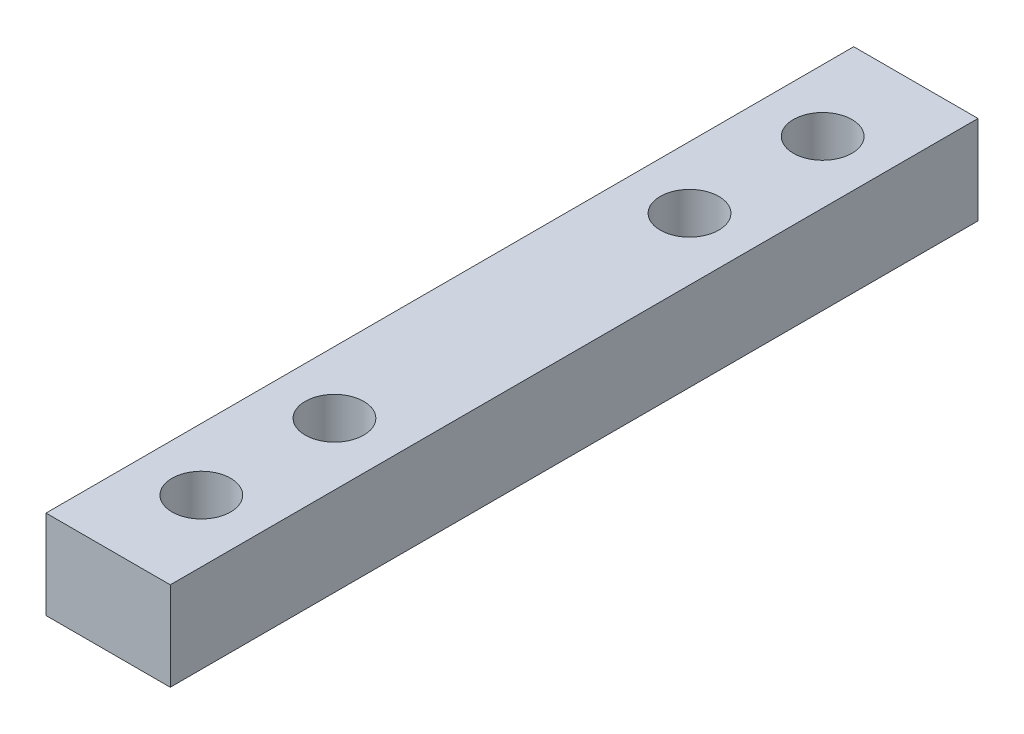
ISO-10303-21;
HEADER;
FILE_DESCRIPTION(('STEP AP214'),'2;1');
FILE_NAME('part.step','',(''),(''),'','','');
FILE_SCHEMA(('AUTOMOTIVE_DESIGN { 1 0 10303 214 1 1 1 1 }'));
ENDSEC;
DATA;
#1=APPLICATION_CONTEXT('core data for automotive mechanical design processes');
#2=APPLICATION_PROTOCOL_DEFINITION('international standard','automotive_design',2000,#1);
#3=PRODUCT_CONTEXT('',#1,'mechanical');
#4=PRODUCT('Part','Part','',(#3));
#5=PRODUCT_RELATED_PRODUCT_CATEGORY('part','',(#4));
#6=PRODUCT_DEFINITION_FORMATION('','',#4);
#7=PRODUCT_DEFINITION_CONTEXT('part definition',#1,'design');
#8=PRODUCT_DEFINITION('design','',#6,#7);
#9=PRODUCT_DEFINITION_SHAPE('','',#8);
#10=(LENGTH_UNIT() NAMED_UNIT(*) SI_UNIT(.MILLI.,.METRE.));
#11=(NAMED_UNIT(*) PLANE_ANGLE_UNIT() SI_UNIT($,.RADIAN.));
#12=(NAMED_UNIT(*) SI_UNIT($,.STERADIAN.) SOLID_ANGLE_UNIT());
#13=UNCERTAINTY_MEASURE_WITH_UNIT(LENGTH_MEASURE(1.E-05),#10,'distance_accuracy_value','');
#14=(GEOMETRIC_REPRESENTATION_CONTEXT(3) GLOBAL_UNCERTAINTY_ASSIGNED_CONTEXT((#13)) GLOBAL_UNIT_ASSIGNED_CONTEXT((#10,
#11,#12)) REPRESENTATION_CONTEXT('',''));
#15=CARTESIAN_POINT('',(0.,0.,0.));
#16=DIRECTION('',(0.,0.,1.));
#17=DIRECTION('',(1.,0.,0.));
#18=AXIS2_PLACEMENT_3D('',#15,#16,#17);
#19=CARTESIAN_POINT('',(3.5,5.,-22.75));
#20=DIRECTION('',(-1.,0.,0.));
#21=DIRECTION('',(0.,0.,1.));
#22=AXIS2_PLACEMENT_3D('',#19,#20,#21);
#23=PLANE('',#22);
#24=DIRECTION('',(0.,0.,-1.));
#25=VECTOR('',#24,1.);
#26=CARTESIAN_POINT('',(3.5,0.,-22.75));
#27=LINE('',#26,#25);
#28=CARTESIAN_POINT('',(3.5,0.,22.75));
#29=VERTEX_POINT('',#28);
#30=CARTESIAN_POINT('',(3.5,0.,-22.75));
#31=VERTEX_POINT('',#30);
#32=EDGE_CURVE('E98',#29,#31,#27,.T.);
#33=ORIENTED_EDGE('',*,*,#32,.T.);
#34=DIRECTION('',(0.,-1.,0.));
#35=VECTOR('',#34,1.);
#36=CARTESIAN_POINT('',(3.5,5.,-22.75));
#37=LINE('',#36,#35);
#38=CARTESIAN_POINT('',(3.5,5.,-22.75));
#39=VERTEX_POINT('',#38);
#40=EDGE_CURVE('E11',#39,#31,#37,.T.);
#41=ORIENTED_EDGE('',*,*,#40,.F.);
#42=DIRECTION('',(0.,0.,-1.));
#43=VECTOR('',#42,1.);
#44=CARTESIAN_POINT('',(3.5,5.,-22.75));
#45=LINE('',#44,#43);
#46=CARTESIAN_POINT('',(3.5,5.,22.75));
#47=VERTEX_POINT('',#46);
#48=EDGE_CURVE('E86',#47,#39,#45,.T.);
#49=ORIENTED_EDGE('',*,*,#48,.F.);
#50=DIRECTION('',(0.,-1.,0.));
#51=VECTOR('',#50,1.);
#52=CARTESIAN_POINT('',(3.5,5.,22.75));
#53=LINE('',#52,#51);
#54=EDGE_CURVE('E94',#47,#29,#53,.T.);
#55=ORIENTED_EDGE('',*,*,#54,.T.);
#56=EDGE_LOOP('',(#33,#41,#49,#55));
#57=FACE_BOUND('',#56,.T.);
#58=ADVANCED_FACE('F35',(#57),#23,.F.);
#59=CARTESIAN_POINT('',(-3.5,5.,-22.75));
#60=DIRECTION('',(0.,0.,1.));
#61=DIRECTION('',(1.,0.,0.));
#62=AXIS2_PLACEMENT_3D('',#59,#60,#61);
#63=PLANE('',#62);
#64=DIRECTION('',(-1.,0.,0.));
#65=VECTOR('',#64,1.);
#66=CARTESIAN_POINT('',(-3.5,0.,-22.75));
#67=LINE('',#66,#65);
#68=CARTESIAN_POINT('',(-3.5,0.,-22.75));
#69=VERTEX_POINT('',#68);
#70=EDGE_CURVE('E90',#31,#69,#67,.T.);
#71=ORIENTED_EDGE('',*,*,#70,.T.);
#72=DIRECTION('',(0.,-1.,0.));
#73=VECTOR('',#72,1.);
#74=CARTESIAN_POINT('',(-3.5,5.,-22.75));
#75=LINE('',#74,#73);
#76=CARTESIAN_POINT('',(-3.5,5.,-22.75));
#77=VERTEX_POINT('',#76);
#78=EDGE_CURVE('E43',#77,#69,#75,.T.);
#79=ORIENTED_EDGE('',*,*,#78,.F.);
#80=DIRECTION('',(-1.,0.,0.));
#81=VECTOR('',#80,1.);
#82=CARTESIAN_POINT('',(-3.5,5.,-22.75));
#83=LINE('',#82,#81);
#84=EDGE_CURVE('E81',#39,#77,#83,.T.);
#85=ORIENTED_EDGE('',*,*,#84,.F.);
#86=ORIENTED_EDGE('',*,*,#40,.T.);
#87=EDGE_LOOP('',(#71,#79,#85,#86));
#88=FACE_BOUND('',#87,.T.);
#89=ADVANCED_FACE('F89',(#88),#63,.F.);
#90=CARTESIAN_POINT('',(-3.5,5.,-22.75));
#91=DIRECTION('',(1.,0.,0.));
#92=DIRECTION('',(0.,0.,-1.));
#93=AXIS2_PLACEMENT_3D('',#90,#91,#92);
#94=PLANE('',#93);
#95=DIRECTION('',(0.,0.,1.));
#96=VECTOR('',#95,1.);
#97=CARTESIAN_POINT('',(-3.5,0.,-22.75));
#98=LINE('',#97,#96);
#99=CARTESIAN_POINT('',(-3.5,0.,22.75));
#100=VERTEX_POINT('',#99);
#101=EDGE_CURVE('E68',#69,#100,#98,.T.);
#102=ORIENTED_EDGE('',*,*,#101,.T.);
#103=DIRECTION('',(0.,-1.,0.));
#104=VECTOR('',#103,1.);
#105=CARTESIAN_POINT('',(-3.5,5.,22.75));
#106=LINE('',#105,#104);
#107=CARTESIAN_POINT('',(-3.5,5.,22.75));
#108=VERTEX_POINT('',#107);
#109=EDGE_CURVE('E91',#108,#100,#106,.T.);
#110=ORIENTED_EDGE('',*,*,#109,.F.);
#111=DIRECTION('',(0.,0.,1.));
#112=VECTOR('',#111,1.);
#113=CARTESIAN_POINT('',(-3.5,5.,-22.75));
#114=LINE('',#113,#112);
#115=EDGE_CURVE('E84',#77,#108,#114,.T.);
#116=ORIENTED_EDGE('',*,*,#115,.F.);
#117=ORIENTED_EDGE('',*,*,#78,.T.);
#118=EDGE_LOOP('',(#102,#110,#116,#117));
#119=FACE_BOUND('',#118,.T.);
#120=ADVANCED_FACE('F92',(#119),#94,.F.);
#121=CARTESIAN_POINT('',(-3.5,5.,22.75));
#122=DIRECTION('',(0.,0.,-1.));
#123=DIRECTION('',(-1.,0.,0.));
#124=AXIS2_PLACEMENT_3D('',#121,#122,#123);
#125=PLANE('',#124);
#126=DIRECTION('',(1.,0.,0.));
#127=VECTOR('',#126,1.);
#128=CARTESIAN_POINT('',(-3.5,0.,22.75));
#129=LINE('',#128,#127);
#130=EDGE_CURVE('E74',#100,#29,#129,.T.);
#131=ORIENTED_EDGE('',*,*,#130,.T.);
#132=ORIENTED_EDGE('',*,*,#54,.F.);
#133=DIRECTION('',(1.,0.,0.));
#134=VECTOR('',#133,1.);
#135=CARTESIAN_POINT('',(-3.5,5.,22.75));
#136=LINE('',#135,#134);
#137=EDGE_CURVE('E51',#108,#47,#136,.T.);
#138=ORIENTED_EDGE('',*,*,#137,.F.);
#139=ORIENTED_EDGE('',*,*,#109,.T.);
#140=EDGE_LOOP('',(#131,#132,#138,#139));
#141=FACE_BOUND('',#140,.T.);
#142=ADVANCED_FACE('F106',(#141),#125,.F.);
#143=CARTESIAN_POINT('',(0.,5.,0.));
#144=DIRECTION('',(0.,1.,0.));
#145=DIRECTION('',(0.,0.,1.));
#146=AXIS2_PLACEMENT_3D('',#143,#144,#145);
#147=PLANE('',#146);
#148=CARTESIAN_POINT('',(0.,5.,-10.));
#149=DIRECTION('',(0.,1.,0.));
#150=DIRECTION('',(0.,0.,1.));
#151=AXIS2_PLACEMENT_3D('',#148,#149,#150);
#152=CIRCLE('',#151,1.65);
#153=CARTESIAN_POINT('',(0.,5.,-8.35));
#154=VERTEX_POINT('',#153);
#155=EDGE_CURVE('E127',#154,#154,#152,.T.);
#156=ORIENTED_EDGE('',*,*,#155,.F.);
#157=EDGE_LOOP('',(#156));
#158=FACE_BOUND('',#157,.T.);
#159=CARTESIAN_POINT('',(0.,5.,10.));
#160=DIRECTION('',(0.,1.,0.));
#161=DIRECTION('',(0.,0.,1.));
#162=AXIS2_PLACEMENT_3D('',#159,#160,#161);
#163=CIRCLE('',#162,1.65);
#164=CARTESIAN_POINT('',(0.,5.,11.65));
#165=VERTEX_POINT('',#164);
#166=EDGE_CURVE('E128',#165,#165,#163,.T.);
#167=ORIENTED_EDGE('',*,*,#166,.F.);
#168=EDGE_LOOP('',(#167));
#169=FACE_BOUND('',#168,.T.);
#170=CARTESIAN_POINT('',(0.,5.,-17.5));
#171=DIRECTION('',(0.,1.,0.));
#172=DIRECTION('',(0.,0.,1.));
#173=AXIS2_PLACEMENT_3D('',#170,#171,#172);
#174=CIRCLE('',#173,1.65);
#175=CARTESIAN_POINT('',(0.,5.,-15.85));
#176=VERTEX_POINT('',#175);
#177=EDGE_CURVE('E115',#176,#176,#174,.T.);
#178=ORIENTED_EDGE('',*,*,#177,.F.);
#179=EDGE_LOOP('',(#178));
#180=FACE_BOUND('',#179,.T.);
#181=CARTESIAN_POINT('',(0.,5.,17.5));
#182=DIRECTION('',(0.,1.,0.));
#183=DIRECTION('',(0.,0.,1.));
#184=AXIS2_PLACEMENT_3D('',#181,#182,#183);
#185=CIRCLE('',#184,1.65);
#186=CARTESIAN_POINT('',(0.,5.,19.15));
#187=VERTEX_POINT('',#186);
#188=EDGE_CURVE('E116',#187,#187,#185,.T.);
#189=ORIENTED_EDGE('',*,*,#188,.F.);
#190=EDGE_LOOP('',(#189));
#191=FACE_BOUND('',#190,.T.);
#192=ORIENTED_EDGE('',*,*,#48,.T.);
#193=ORIENTED_EDGE('',*,*,#84,.T.);
#194=ORIENTED_EDGE('',*,*,#115,.T.);
#195=ORIENTED_EDGE('',*,*,#137,.T.);
#196=EDGE_LOOP('',(#192,#193,#194,#195));
#197=FACE_BOUND('',#196,.T.);
#198=ADVANCED_FACE('F82',(#158,#169,#180,#191,#197),#147,.T.);
#199=CARTESIAN_POINT('',(0.,0.,0.));
#200=DIRECTION('',(0.,1.,0.));
#201=DIRECTION('',(0.,0.,1.));
#202=AXIS2_PLACEMENT_3D('',#199,#200,#201);
#203=PLANE('',#202);
#204=CARTESIAN_POINT('',(0.,0.,-10.));
#205=DIRECTION('',(0.,1.,0.));
#206=DIRECTION('',(0.,0.,1.));
#207=AXIS2_PLACEMENT_3D('',#204,#205,#206);
#208=CIRCLE('',#207,1.65);
#209=CARTESIAN_POINT('',(0.,0.,-8.35));
#210=VERTEX_POINT('',#209);
#211=EDGE_CURVE('E119',#210,#210,#208,.F.);
#212=ORIENTED_EDGE('',*,*,#211,.F.);
#213=EDGE_LOOP('',(#212));
#214=FACE_BOUND('',#213,.T.);
#215=CARTESIAN_POINT('',(0.,0.,10.));
#216=DIRECTION('',(0.,1.,0.));
#217=DIRECTION('',(0.,0.,1.));
#218=AXIS2_PLACEMENT_3D('',#215,#216,#217);
#219=CIRCLE('',#218,1.65);
#220=CARTESIAN_POINT('',(0.,0.,11.65));
#221=VERTEX_POINT('',#220);
#222=EDGE_CURVE('E124',#221,#221,#219,.F.);
#223=ORIENTED_EDGE('',*,*,#222,.F.);
#224=EDGE_LOOP('',(#223));
#225=FACE_BOUND('',#224,.T.);
#226=CARTESIAN_POINT('',(0.,0.,-17.5));
#227=DIRECTION('',(0.,1.,0.));
#228=DIRECTION('',(0.,0.,1.));
#229=AXIS2_PLACEMENT_3D('',#226,#227,#228);
#230=CIRCLE('',#229,1.65);
#231=CARTESIAN_POINT('',(0.,0.,-15.85));
#232=VERTEX_POINT('',#231);
#233=EDGE_CURVE('E101',#232,#232,#230,.F.);
#234=ORIENTED_EDGE('',*,*,#233,.F.);
#235=EDGE_LOOP('',(#234));
#236=FACE_BOUND('',#235,.T.);
#237=CARTESIAN_POINT('',(0.,0.,17.5));
#238=DIRECTION('',(0.,1.,0.));
#239=DIRECTION('',(0.,0.,1.));
#240=AXIS2_PLACEMENT_3D('',#237,#238,#239);
#241=CIRCLE('',#240,1.65);
#242=CARTESIAN_POINT('',(0.,0.,19.15));
#243=VERTEX_POINT('',#242);
#244=EDGE_CURVE('E112',#243,#243,#241,.F.);
#245=ORIENTED_EDGE('',*,*,#244,.F.);
#246=EDGE_LOOP('',(#245));
#247=FACE_BOUND('',#246,.T.);
#248=ORIENTED_EDGE('',*,*,#32,.F.);
#249=ORIENTED_EDGE('',*,*,#130,.F.);
#250=ORIENTED_EDGE('',*,*,#101,.F.);
#251=ORIENTED_EDGE('',*,*,#70,.F.);
#252=EDGE_LOOP('',(#248,#249,#250,#251));
#253=FACE_BOUND('',#252,.T.);
#254=ADVANCED_FACE('F109',(#214,#225,#236,#247,#253),#203,.F.);
#255=CARTESIAN_POINT('',(0.,-0.00100000000000013,17.5));
#256=DIRECTION('',(0.,1.,0.));
#257=DIRECTION('',(0.,0.,1.));
#258=AXIS2_PLACEMENT_3D('',#255,#256,#257);
#259=CYLINDRICAL_SURFACE('',#258,1.65);
#260=ORIENTED_EDGE('',*,*,#188,.T.);
#261=EDGE_LOOP('',(#260));
#262=FACE_BOUND('',#261,.T.);
#263=ORIENTED_EDGE('',*,*,#244,.T.);
#264=EDGE_LOOP('',(#263));
#265=FACE_BOUND('',#264,.T.);
#266=ADVANCED_FACE('F148',(#262,#265),#259,.F.);
#267=CARTESIAN_POINT('',(0.,-0.00100000000000013,-17.5));
#268=DIRECTION('',(0.,1.,0.));
#269=DIRECTION('',(0.,0.,1.));
#270=AXIS2_PLACEMENT_3D('',#267,#268,#269);
#271=CYLINDRICAL_SURFACE('',#270,1.65);
#272=ORIENTED_EDGE('',*,*,#177,.T.);
#273=EDGE_LOOP('',(#272));
#274=FACE_BOUND('',#273,.T.);
#275=ORIENTED_EDGE('',*,*,#233,.T.);
#276=EDGE_LOOP('',(#275));
#277=FACE_BOUND('',#276,.T.);
#278=ADVANCED_FACE('F151',(#274,#277),#271,.F.);
#279=CARTESIAN_POINT('',(0.,-0.00100000000000013,10.));
#280=DIRECTION('',(0.,1.,0.));
#281=DIRECTION('',(0.,0.,1.));
#282=AXIS2_PLACEMENT_3D('',#279,#280,#281);
#283=CYLINDRICAL_SURFACE('',#282,1.65);
#284=ORIENTED_EDGE('',*,*,#166,.T.);
#285=EDGE_LOOP('',(#284));
#286=FACE_BOUND('',#285,.T.);
#287=ORIENTED_EDGE('',*,*,#222,.T.);
#288=EDGE_LOOP('',(#287));
#289=FACE_BOUND('',#288,.T.);
#290=ADVANCED_FACE('F195',(#286,#289),#283,.F.);
#291=CARTESIAN_POINT('',(0.,-0.00100000000000013,-10.));
#292=DIRECTION('',(0.,1.,0.));
#293=DIRECTION('',(0.,0.,1.));
#294=AXIS2_PLACEMENT_3D('',#291,#292,#293);
#295=CYLINDRICAL_SURFACE('',#294,1.65);
#296=ORIENTED_EDGE('',*,*,#155,.T.);
#297=EDGE_LOOP('',(#296));
#298=FACE_BOUND('',#297,.T.);
#299=ORIENTED_EDGE('',*,*,#211,.T.);
#300=EDGE_LOOP('',(#299));
#301=FACE_BOUND('',#300,.T.);
#302=ADVANCED_FACE('F136',(#298,#301),#295,.F.);
#303=CLOSED_SHELL('',(#58,#89,#120,#142,#198,#254,#266,#278,#290,#302));
#304=MANIFOLD_SOLID_BREP('B2',#303);
#305=ADVANCED_BREP_SHAPE_REPRESENTATION('',(#18,#304),#14);
#306=SHAPE_DEFINITION_REPRESENTATION(#9,#305);
ENDSEC;
END-ISO-10303-21;
